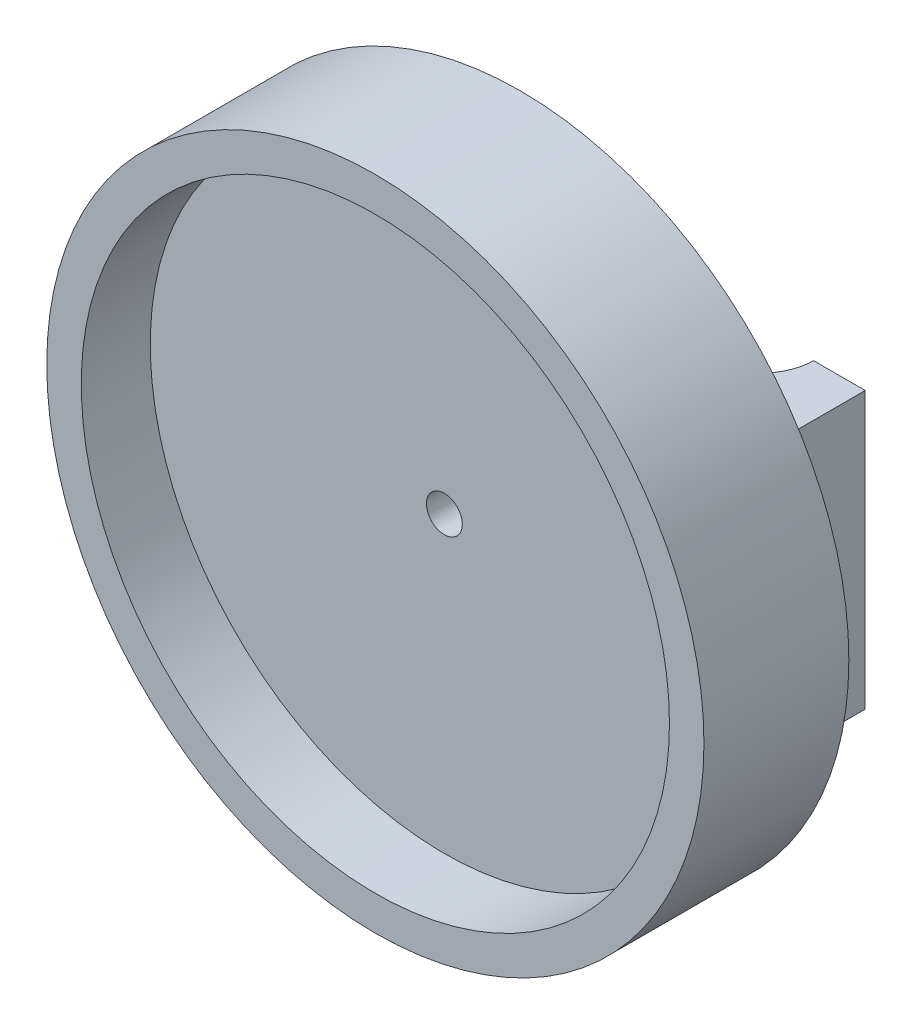
ISO-10303-21;
HEADER;
FILE_DESCRIPTION(('STEP AP214'),'2;1');
FILE_NAME('part.step','',(''),(''),'','','');
FILE_SCHEMA(('AUTOMOTIVE_DESIGN { 1 0 10303 214 1 1 1 1 }'));
ENDSEC;
DATA;
#1=APPLICATION_CONTEXT('core data for automotive mechanical design processes');
#2=APPLICATION_PROTOCOL_DEFINITION('international standard','automotive_design',2000,#1);
#3=PRODUCT_CONTEXT('',#1,'mechanical');
#4=PRODUCT('Part','Part','',(#3));
#5=PRODUCT_RELATED_PRODUCT_CATEGORY('part','',(#4));
#6=PRODUCT_DEFINITION_FORMATION('','',#4);
#7=PRODUCT_DEFINITION_CONTEXT('part definition',#1,'design');
#8=PRODUCT_DEFINITION('design','',#6,#7);
#9=PRODUCT_DEFINITION_SHAPE('','',#8);
#10=(LENGTH_UNIT() NAMED_UNIT(*) SI_UNIT(.MILLI.,.METRE.));
#11=(NAMED_UNIT(*) PLANE_ANGLE_UNIT() SI_UNIT($,.RADIAN.));
#12=(NAMED_UNIT(*) SI_UNIT($,.STERADIAN.) SOLID_ANGLE_UNIT());
#13=UNCERTAINTY_MEASURE_WITH_UNIT(LENGTH_MEASURE(1.E-05),#10,'distance_accuracy_value','');
#14=(GEOMETRIC_REPRESENTATION_CONTEXT(3) GLOBAL_UNCERTAINTY_ASSIGNED_CONTEXT((#13)) GLOBAL_UNIT_ASSIGNED_CONTEXT((#10,
#11,#12)) REPRESENTATION_CONTEXT('',''));
#15=CARTESIAN_POINT('',(0.,0.,0.));
#16=DIRECTION('',(0.,0.,1.));
#17=DIRECTION('',(1.,0.,0.));
#18=AXIS2_PLACEMENT_3D('',#15,#16,#17);
#19=CARTESIAN_POINT('',(0.,0.,-15.));
#20=DIRECTION('',(0.,0.,1.));
#21=DIRECTION('',(1.,0.,0.));
#22=AXIS2_PLACEMENT_3D('',#19,#20,#21);
#23=PLANE('',#22);
#24=CARTESIAN_POINT('',(0.,0.,-15.));
#25=DIRECTION('',(0.,0.,-1.));
#26=DIRECTION('',(-1.,0.,0.));
#27=AXIS2_PLACEMENT_3D('',#24,#25,#26);
#28=CIRCLE('',#27,2.6);
#29=CARTESIAN_POINT('',(-2.6,0.,-15.));
#30=VERTEX_POINT('',#29);
#31=EDGE_CURVE('E193',#30,#30,#28,.T.);
#32=ORIENTED_EDGE('',*,*,#31,.F.);
#33=EDGE_LOOP('',(#32));
#34=FACE_BOUND('',#33,.T.);
#35=DIRECTION('',(-1.,0.,0.));
#36=VECTOR('',#35,1.);
#37=CARTESIAN_POINT('',(0.,-16.5,-15.));
#38=LINE('',#37,#36);
#39=CARTESIAN_POINT('',(12.5,-16.5,-15.));
#40=VERTEX_POINT('',#39);
#41=CARTESIAN_POINT('',(8.5,-16.5,-15.));
#42=VERTEX_POINT('',#41);
#43=EDGE_CURVE('E170',#40,#42,#38,.T.);
#44=ORIENTED_EDGE('',*,*,#43,.F.);
#45=DIRECTION('',(0.,1.,0.));
#46=VECTOR('',#45,1.);
#47=CARTESIAN_POINT('',(12.5,-47.625,-15.));
#48=LINE('',#47,#46);
#49=CARTESIAN_POINT('',(12.5,-20.,-15.));
#50=VERTEX_POINT('',#49);
#51=EDGE_CURVE('E257',#40,#50,#48,.F.);
#52=ORIENTED_EDGE('',*,*,#51,.T.);
#53=DIRECTION('',(-1.,0.,0.));
#54=VECTOR('',#53,1.);
#55=CARTESIAN_POINT('',(35.,-20.,-15.));
#56=LINE('',#55,#54);
#57=CARTESIAN_POINT('',(-12.5,-20.,-15.));
#58=VERTEX_POINT('',#57);
#59=EDGE_CURVE('E218',#50,#58,#56,.T.);
#60=ORIENTED_EDGE('',*,*,#59,.T.);
#61=DIRECTION('',(0.,1.,0.));
#62=VECTOR('',#61,1.);
#63=CARTESIAN_POINT('',(-12.5,-47.625,-15.));
#64=LINE('',#63,#62);
#65=CARTESIAN_POINT('',(-12.5,-16.5,-15.));
#66=VERTEX_POINT('',#65);
#67=EDGE_CURVE('E270',#58,#66,#64,.T.);
#68=ORIENTED_EDGE('',*,*,#67,.T.);
#69=DIRECTION('',(-1.,0.,0.));
#70=VECTOR('',#69,1.);
#71=CARTESIAN_POINT('',(0.,-16.5,-15.));
#72=LINE('',#71,#70);
#73=CARTESIAN_POINT('',(-8.5,-16.5,-15.));
#74=VERTEX_POINT('',#73);
#75=EDGE_CURVE('E188',#74,#66,#72,.T.);
#76=ORIENTED_EDGE('',*,*,#75,.F.);
#77=DIRECTION('',(0.,1.,0.));
#78=VECTOR('',#77,1.);
#79=CARTESIAN_POINT('',(-8.5,-16.5,-15.));
#80=LINE('',#79,#78);
#81=CARTESIAN_POINT('',(-8.5,16.5,-15.));
#82=VERTEX_POINT('',#81);
#83=EDGE_CURVE('E190',#74,#82,#80,.T.);
#84=ORIENTED_EDGE('',*,*,#83,.T.);
#85=DIRECTION('',(-1.,0.,0.));
#86=VECTOR('',#85,1.);
#87=CARTESIAN_POINT('',(0.,16.5,-15.));
#88=LINE('',#87,#86);
#89=CARTESIAN_POINT('',(-12.5,16.5,-15.));
#90=VERTEX_POINT('',#89);
#91=EDGE_CURVE('E183',#82,#90,#88,.T.);
#92=ORIENTED_EDGE('',*,*,#91,.T.);
#93=CARTESIAN_POINT('',(-12.5,20.,-15.));
#94=VERTEX_POINT('',#93);
#95=EDGE_CURVE('E269',#90,#94,#64,.T.);
#96=ORIENTED_EDGE('',*,*,#95,.T.);
#97=DIRECTION('',(1.,0.,0.));
#98=VECTOR('',#97,1.);
#99=CARTESIAN_POINT('',(35.,20.,-15.));
#100=LINE('',#99,#98);
#101=CARTESIAN_POINT('',(12.5,20.,-15.));
#102=VERTEX_POINT('',#101);
#103=EDGE_CURVE('E225',#94,#102,#100,.T.);
#104=ORIENTED_EDGE('',*,*,#103,.T.);
#105=CARTESIAN_POINT('',(12.5,16.5,-15.));
#106=VERTEX_POINT('',#105);
#107=EDGE_CURVE('E260',#102,#106,#48,.F.);
#108=ORIENTED_EDGE('',*,*,#107,.T.);
#109=DIRECTION('',(-1.,0.,0.));
#110=VECTOR('',#109,1.);
#111=CARTESIAN_POINT('',(0.,16.5,-15.));
#112=LINE('',#111,#110);
#113=CARTESIAN_POINT('',(8.5,16.5,-15.));
#114=VERTEX_POINT('',#113);
#115=EDGE_CURVE('E48',#106,#114,#112,.T.);
#116=ORIENTED_EDGE('',*,*,#115,.T.);
#117=DIRECTION('',(0.,1.,0.));
#118=VECTOR('',#117,1.);
#119=CARTESIAN_POINT('',(8.5,-16.5,-15.));
#120=LINE('',#119,#118);
#121=EDGE_CURVE('E160',#114,#42,#120,.F.);
#122=ORIENTED_EDGE('',*,*,#121,.T.);
#123=EDGE_LOOP('',(#44,#52,#60,#68,#76,#84,#92,#96,#104,#108,#116,#122));
#124=FACE_BOUND('',#123,.T.);
#125=ADVANCED_FACE('F33',(#34,#124),#23,.F.);
#126=DIRECTION('',(-1.,0.,0.));
#127=VECTOR('',#126,1.);
#128=CARTESIAN_POINT('',(0.,-16.5,-15.));
#129=LINE('',#128,#127);
#130=CARTESIAN_POINT('',(31.5,-16.5,-15.));
#131=VERTEX_POINT('',#130);
#132=CARTESIAN_POINT('',(27.5,-16.5,-15.));
#133=VERTEX_POINT('',#132);
#134=EDGE_CURVE('E165',#131,#133,#129,.T.);
#135=ORIENTED_EDGE('',*,*,#134,.F.);
#136=DIRECTION('',(0.,1.,0.));
#137=VECTOR('',#136,1.);
#138=CARTESIAN_POINT('',(31.5,-16.5,-15.));
#139=LINE('',#138,#137);
#140=CARTESIAN_POINT('',(31.5,16.5,-15.));
#141=VERTEX_POINT('',#140);
#142=EDGE_CURVE('E11',#131,#141,#139,.T.);
#143=ORIENTED_EDGE('',*,*,#142,.T.);
#144=DIRECTION('',(-1.,0.,0.));
#145=VECTOR('',#144,1.);
#146=CARTESIAN_POINT('',(0.,16.5,-15.));
#147=LINE('',#146,#145);
#148=CARTESIAN_POINT('',(27.5,16.5,-15.));
#149=VERTEX_POINT('',#148);
#150=EDGE_CURVE('E146',#141,#149,#147,.T.);
#151=ORIENTED_EDGE('',*,*,#150,.T.);
#152=DIRECTION('',(0.,1.,0.));
#153=VECTOR('',#152,1.);
#154=CARTESIAN_POINT('',(27.5,-47.625,-15.));
#155=LINE('',#154,#153);
#156=CARTESIAN_POINT('',(27.5,20.,-15.));
#157=VERTEX_POINT('',#156);
#158=EDGE_CURVE('E263',#149,#157,#155,.T.);
#159=ORIENTED_EDGE('',*,*,#158,.T.);
#160=CARTESIAN_POINT('',(35.,20.,-15.));
#161=VERTEX_POINT('',#160);
#162=EDGE_CURVE('E220',#157,#161,#100,.T.);
#163=ORIENTED_EDGE('',*,*,#162,.T.);
#164=DIRECTION('',(0.,-1.,0.));
#165=VECTOR('',#164,1.);
#166=CARTESIAN_POINT('',(35.,-20.,-15.));
#167=LINE('',#166,#165);
#168=CARTESIAN_POINT('',(35.,-20.,-15.));
#169=VERTEX_POINT('',#168);
#170=EDGE_CURVE('E210',#161,#169,#167,.T.);
#171=ORIENTED_EDGE('',*,*,#170,.T.);
#172=CARTESIAN_POINT('',(27.5,-20.,-15.));
#173=VERTEX_POINT('',#172);
#174=EDGE_CURVE('E215',#169,#173,#56,.T.);
#175=ORIENTED_EDGE('',*,*,#174,.T.);
#176=EDGE_CURVE('E167',#173,#133,#155,.T.);
#177=ORIENTED_EDGE('',*,*,#176,.T.);
#178=EDGE_LOOP('',(#135,#143,#151,#159,#163,#171,#175,#177));
#179=FACE_BOUND('',#178,.T.);
#180=ADVANCED_FACE('F163',(#179),#23,.F.);
#181=CARTESIAN_POINT('',(20.,-47.625,-15.));
#182=DIRECTION('',(0.,1.,0.));
#183=DIRECTION('',(0.,0.,1.));
#184=AXIS2_PLACEMENT_3D('',#181,#182,#183);
#185=CYLINDRICAL_SURFACE('',#184,7.5);
#186=CARTESIAN_POINT('',(20.,-16.5,-15.));
#187=DIRECTION('',(0.,1.,0.));
#188=DIRECTION('',(0.,0.,1.));
#189=AXIS2_PLACEMENT_3D('',#186,#187,#188);
#190=CIRCLE('',#189,7.5);
#191=EDGE_CURVE('E41',#133,#40,#190,.F.);
#192=ORIENTED_EDGE('',*,*,#191,.F.);
#193=ORIENTED_EDGE('',*,*,#176,.F.);
#194=CARTESIAN_POINT('',(20.,-20.,-15.));
#195=DIRECTION('',(0.,1.,0.));
#196=DIRECTION('',(0.,0.,1.));
#197=AXIS2_PLACEMENT_3D('',#194,#195,#196);
#198=CIRCLE('',#197,7.5);
#199=EDGE_CURVE('E206',#50,#173,#198,.T.);
#200=ORIENTED_EDGE('',*,*,#199,.F.);
#201=ORIENTED_EDGE('',*,*,#51,.F.);
#202=EDGE_LOOP('',(#192,#193,#200,#201));
#203=FACE_BOUND('',#202,.T.);
#204=ADVANCED_FACE('F289',(#203),#185,.F.);
#205=DIRECTION('',(-1.,0.,0.));
#206=VECTOR('',#205,1.);
#207=CARTESIAN_POINT('',(0.,-16.5,-15.));
#208=LINE('',#207,#206);
#209=CARTESIAN_POINT('',(-27.5,-16.5,-15.));
#210=VERTEX_POINT('',#209);
#211=CARTESIAN_POINT('',(-31.5,-16.5,-15.));
#212=VERTEX_POINT('',#211);
#213=EDGE_CURVE('E186',#210,#212,#208,.T.);
#214=ORIENTED_EDGE('',*,*,#213,.F.);
#215=DIRECTION('',(0.,1.,0.));
#216=VECTOR('',#215,1.);
#217=CARTESIAN_POINT('',(-27.5,-47.625,-15.));
#218=LINE('',#217,#216);
#219=CARTESIAN_POINT('',(-27.5,-20.,-15.));
#220=VERTEX_POINT('',#219);
#221=EDGE_CURVE('E265',#210,#220,#218,.F.);
#222=ORIENTED_EDGE('',*,*,#221,.T.);
#223=CARTESIAN_POINT('',(-35.,-20.,-15.));
#224=VERTEX_POINT('',#223);
#225=EDGE_CURVE('E213',#220,#224,#56,.T.);
#226=ORIENTED_EDGE('',*,*,#225,.T.);
#227=DIRECTION('',(0.,1.,0.));
#228=VECTOR('',#227,1.);
#229=CARTESIAN_POINT('',(-35.,-20.,-15.));
#230=LINE('',#229,#228);
#231=CARTESIAN_POINT('',(-35.,20.,-15.));
#232=VERTEX_POINT('',#231);
#233=EDGE_CURVE('E217',#224,#232,#230,.T.);
#234=ORIENTED_EDGE('',*,*,#233,.T.);
#235=CARTESIAN_POINT('',(-27.5,20.,-15.));
#236=VERTEX_POINT('',#235);
#237=EDGE_CURVE('E221',#232,#236,#100,.T.);
#238=ORIENTED_EDGE('',*,*,#237,.T.);
#239=CARTESIAN_POINT('',(-27.5,16.5,-15.));
#240=VERTEX_POINT('',#239);
#241=EDGE_CURVE('E266',#236,#240,#218,.F.);
#242=ORIENTED_EDGE('',*,*,#241,.T.);
#243=DIRECTION('',(-1.,0.,0.));
#244=VECTOR('',#243,1.);
#245=CARTESIAN_POINT('',(0.,16.5,-15.));
#246=LINE('',#245,#244);
#247=CARTESIAN_POINT('',(-31.5,16.5,-15.));
#248=VERTEX_POINT('',#247);
#249=EDGE_CURVE('E56',#240,#248,#246,.T.);
#250=ORIENTED_EDGE('',*,*,#249,.T.);
#251=DIRECTION('',(0.,1.,0.));
#252=VECTOR('',#251,1.);
#253=CARTESIAN_POINT('',(-31.5,-16.5,-15.));
#254=LINE('',#253,#252);
#255=EDGE_CURVE('E279',#248,#212,#254,.F.);
#256=ORIENTED_EDGE('',*,*,#255,.T.);
#257=EDGE_LOOP('',(#214,#222,#226,#234,#238,#242,#250,#256));
#258=FACE_BOUND('',#257,.T.);
#259=ADVANCED_FACE('F298',(#258),#23,.F.);
#260=CARTESIAN_POINT('',(-20.,-47.625,-15.));
#261=DIRECTION('',(0.,1.,0.));
#262=DIRECTION('',(0.,0.,1.));
#263=AXIS2_PLACEMENT_3D('',#260,#261,#262);
#264=CYLINDRICAL_SURFACE('',#263,7.5);
#265=CARTESIAN_POINT('',(-20.,-16.5,-15.));
#266=DIRECTION('',(0.,1.,0.));
#267=DIRECTION('',(0.,0.,1.));
#268=AXIS2_PLACEMENT_3D('',#265,#266,#267);
#269=CIRCLE('',#268,7.5);
#270=EDGE_CURVE('E277',#66,#210,#269,.F.);
#271=ORIENTED_EDGE('',*,*,#270,.F.);
#272=ORIENTED_EDGE('',*,*,#67,.F.);
#273=CARTESIAN_POINT('',(-20.,-20.,-15.));
#274=DIRECTION('',(0.,1.,0.));
#275=DIRECTION('',(0.,0.,1.));
#276=AXIS2_PLACEMENT_3D('',#273,#274,#275);
#277=CIRCLE('',#276,7.5);
#278=EDGE_CURVE('E200',#220,#58,#277,.T.);
#279=ORIENTED_EDGE('',*,*,#278,.F.);
#280=ORIENTED_EDGE('',*,*,#221,.F.);
#281=EDGE_LOOP('',(#271,#272,#279,#280));
#282=FACE_BOUND('',#281,.T.);
#283=ADVANCED_FACE('F321',(#282),#264,.F.);
#284=CARTESIAN_POINT('',(0.,0.,0.));
#285=DIRECTION('',(0.,0.,1.));
#286=DIRECTION('',(1.,0.,0.));
#287=AXIS2_PLACEMENT_3D('',#284,#285,#286);
#288=PLANE('',#287);
#289=CARTESIAN_POINT('',(0.,0.,0.));
#290=DIRECTION('',(0.,0.,1.));
#291=DIRECTION('',(1.,0.,0.));
#292=AXIS2_PLACEMENT_3D('',#289,#290,#291);
#293=CIRCLE('',#292,47.625);
#294=CARTESIAN_POINT('',(-47.625,0.,0.));
#295=VERTEX_POINT('',#294);
#296=EDGE_CURVE('E251',#295,#295,#293,.T.);
#297=ORIENTED_EDGE('',*,*,#296,.F.);
#298=EDGE_LOOP('',(#297));
#299=FACE_BOUND('',#298,.T.);
#300=DIRECTION('',(0.,-1.,0.));
#301=VECTOR('',#300,1.);
#302=CARTESIAN_POINT('',(35.,-20.,0.));
#303=LINE('',#302,#301);
#304=CARTESIAN_POINT('',(35.,20.,0.));
#305=VERTEX_POINT('',#304);
#306=CARTESIAN_POINT('',(35.,-20.,0.));
#307=VERTEX_POINT('',#306);
#308=EDGE_CURVE('E209',#305,#307,#303,.T.);
#309=ORIENTED_EDGE('',*,*,#308,.F.);
#310=DIRECTION('',(1.,0.,0.));
#311=VECTOR('',#310,1.);
#312=CARTESIAN_POINT('',(35.,20.,0.));
#313=LINE('',#312,#311);
#314=CARTESIAN_POINT('',(-35.,20.,0.));
#315=VERTEX_POINT('',#314);
#316=EDGE_CURVE('E214',#315,#305,#313,.T.);
#317=ORIENTED_EDGE('',*,*,#316,.F.);
#318=DIRECTION('',(0.,1.,0.));
#319=VECTOR('',#318,1.);
#320=CARTESIAN_POINT('',(-35.,-20.,0.));
#321=LINE('',#320,#319);
#322=CARTESIAN_POINT('',(-35.,-20.,0.));
#323=VERTEX_POINT('',#322);
#324=EDGE_CURVE('E231',#323,#315,#321,.T.);
#325=ORIENTED_EDGE('',*,*,#324,.F.);
#326=DIRECTION('',(-1.,0.,0.));
#327=VECTOR('',#326,1.);
#328=CARTESIAN_POINT('',(35.,-20.,0.));
#329=LINE('',#328,#327);
#330=EDGE_CURVE('E228',#307,#323,#329,.T.);
#331=ORIENTED_EDGE('',*,*,#330,.F.);
#332=EDGE_LOOP('',(#309,#317,#325,#331));
#333=FACE_BOUND('',#332,.T.);
#334=ADVANCED_FACE('F323',(#299,#333),#288,.F.);
#335=CARTESIAN_POINT('',(0.,0.,21.));
#336=DIRECTION('',(0.,0.,-1.));
#337=DIRECTION('',(-1.,0.,0.));
#338=AXIS2_PLACEMENT_3D('',#335,#336,#337);
#339=CYLINDRICAL_SURFACE('',#338,47.625);
#340=CARTESIAN_POINT('',(0.,0.,21.));
#341=DIRECTION('',(0.,0.,1.));
#342=DIRECTION('',(1.,0.,0.));
#343=AXIS2_PLACEMENT_3D('',#340,#341,#342);
#344=CIRCLE('',#343,47.625);
#345=CARTESIAN_POINT('',(-47.625,0.,21.));
#346=VERTEX_POINT('',#345);
#347=EDGE_CURVE('E254',#346,#346,#344,.T.);
#348=CARTESIAN_POINT('',(-47.625,0.,21.));
#349=CARTESIAN_POINT('',(-47.625,0.,20.78125));
#350=CARTESIAN_POINT('',(-47.625,0.,20.5625));
#351=CARTESIAN_POINT('',(-47.625,0.,20.125));
#352=CARTESIAN_POINT('',(-47.625,0.,19.90625));
#353=CARTESIAN_POINT('',(-47.625,0.,19.46875));
#354=CARTESIAN_POINT('',(-47.625,0.,19.25));
#355=CARTESIAN_POINT('',(-47.625,0.,18.8125));
#356=CARTESIAN_POINT('',(-47.625,0.,18.59375));
#357=CARTESIAN_POINT('',(-47.625,0.,18.15625));
#358=CARTESIAN_POINT('',(-47.625,0.,17.9375));
#359=CARTESIAN_POINT('',(-47.625,0.,17.5));
#360=CARTESIAN_POINT('',(-47.625,0.,17.28125));
#361=CARTESIAN_POINT('',(-47.625,0.,16.84375));
#362=CARTESIAN_POINT('',(-47.625,0.,16.625));
#363=CARTESIAN_POINT('',(-47.625,0.,16.1875));
#364=CARTESIAN_POINT('',(-47.625,0.,15.96875));
#365=CARTESIAN_POINT('',(-47.625,0.,15.53125));
#366=CARTESIAN_POINT('',(-47.625,0.,15.3125));
#367=CARTESIAN_POINT('',(-47.625,0.,14.875));
#368=CARTESIAN_POINT('',(-47.625,0.,14.65625));
#369=CARTESIAN_POINT('',(-47.625,0.,14.21875));
#370=CARTESIAN_POINT('',(-47.625,0.,14.));
#371=CARTESIAN_POINT('',(-47.625,0.,13.5625));
#372=CARTESIAN_POINT('',(-47.625,0.,13.34375));
#373=CARTESIAN_POINT('',(-47.625,0.,12.90625));
#374=CARTESIAN_POINT('',(-47.625,0.,12.6875));
#375=CARTESIAN_POINT('',(-47.625,0.,12.25));
#376=CARTESIAN_POINT('',(-47.625,0.,12.03125));
#377=CARTESIAN_POINT('',(-47.625,0.,11.59375));
#378=CARTESIAN_POINT('',(-47.625,0.,11.375));
#379=CARTESIAN_POINT('',(-47.625,0.,10.9375));
#380=CARTESIAN_POINT('',(-47.625,0.,10.71875));
#381=CARTESIAN_POINT('',(-47.625,0.,10.28125));
#382=CARTESIAN_POINT('',(-47.625,0.,10.0625));
#383=CARTESIAN_POINT('',(-47.625,0.,9.625));
#384=CARTESIAN_POINT('',(-47.625,0.,9.40625));
#385=CARTESIAN_POINT('',(-47.625,0.,8.96875));
#386=CARTESIAN_POINT('',(-47.625,0.,8.75));
#387=CARTESIAN_POINT('',(-47.625,0.,8.3125));
#388=CARTESIAN_POINT('',(-47.625,0.,8.09375));
#389=CARTESIAN_POINT('',(-47.625,0.,7.65625));
#390=CARTESIAN_POINT('',(-47.625,0.,7.4375));
#391=CARTESIAN_POINT('',(-47.625,0.,7.));
#392=CARTESIAN_POINT('',(-47.625,0.,6.78125));
#393=CARTESIAN_POINT('',(-47.625,0.,6.34375));
#394=CARTESIAN_POINT('',(-47.625,0.,6.125));
#395=CARTESIAN_POINT('',(-47.625,0.,5.6875));
#396=CARTESIAN_POINT('',(-47.625,0.,5.46875));
#397=CARTESIAN_POINT('',(-47.625,0.,5.03125));
#398=CARTESIAN_POINT('',(-47.625,0.,4.8125));
#399=CARTESIAN_POINT('',(-47.625,0.,4.375));
#400=CARTESIAN_POINT('',(-47.625,0.,4.15625));
#401=CARTESIAN_POINT('',(-47.625,0.,3.71875));
#402=CARTESIAN_POINT('',(-47.625,0.,3.5));
#403=CARTESIAN_POINT('',(-47.625,0.,3.0625));
#404=CARTESIAN_POINT('',(-47.625,0.,2.84375));
#405=CARTESIAN_POINT('',(-47.625,0.,2.40625));
#406=CARTESIAN_POINT('',(-47.625,0.,2.1875));
#407=CARTESIAN_POINT('',(-47.625,0.,1.75));
#408=CARTESIAN_POINT('',(-47.625,0.,1.53125));
#409=CARTESIAN_POINT('',(-47.625,0.,1.09375));
#410=CARTESIAN_POINT('',(-47.625,0.,0.875000000000001));
#411=CARTESIAN_POINT('',(-47.625,0.,0.4375));
#412=CARTESIAN_POINT('',(-47.625,0.,0.21875));
#413=CARTESIAN_POINT('',(-47.625,0.,0.));
#414=B_SPLINE_CURVE_WITH_KNOTS('',3,(#348,#349,#350,#351,#352,#353,#354,#355,#356,#357,#358,
#359,#360,#361,#362,#363,#364,#365,#366,#367,#368,#369,#370,#371,#372,#373,#374,#375,#376,#377,
#378,#379,#380,#381,#382,#383,#384,#385,#386,#387,#388,#389,#390,#391,#392,#393,#394,#395,#396,
#397,#398,#399,#400,#401,#402,#403,#404,#405,#406,#407,#408,#409,#410,#411,#412,#413),
.UNSPECIFIED.,.F.,.F.,(4,2,2,2,2,2,2,2,2,2,2,2,2,2,2,2,2,2,2,2,2,2,2,2,2,2,2,2,2,2,2,2,4),(0.,
0.656249999999997,1.3125,1.96875,2.625,3.28125,3.9375,4.59375,5.25,5.90625,6.5625,7.21875,7.875,
8.53125,9.1875,9.84375,10.5,11.15625,11.8125,12.46875,13.125,13.78125,14.4375,15.09375,15.75,
16.40625,17.0625,17.71875,18.375,19.03125,19.6875,20.34375,21.),.UNSPECIFIED.);
#415=EDGE_CURVE('BSEAM35',#346,#295,#414,.T.);
#416=ORIENTED_EDGE('',*,*,#347,.F.);
#417=ORIENTED_EDGE('',*,*,#296,.T.);
#418=ORIENTED_EDGE('',*,*,#415,.T.);
#419=ORIENTED_EDGE('',*,*,#415,.F.);
#420=EDGE_LOOP('',(#416,#418,#417,#419));
#421=FACE_BOUND('',#420,.T.);
#422=ADVANCED_FACE('F35',(#421),#339,.T.);
#423=CARTESIAN_POINT('',(0.,0.,21.));
#424=DIRECTION('',(0.,0.,1.));
#425=DIRECTION('',(1.,0.,0.));
#426=AXIS2_PLACEMENT_3D('',#423,#424,#425);
#427=PLANE('',#426);
#428=CARTESIAN_POINT('',(0.,0.,21.));
#429=DIRECTION('',(0.,0.,1.));
#430=DIRECTION('',(1.,0.,0.));
#431=AXIS2_PLACEMENT_3D('',#428,#429,#430);
#432=CIRCLE('',#431,42.625);
#433=CARTESIAN_POINT('',(42.625,0.,21.));
#434=VERTEX_POINT('',#433);
#435=EDGE_CURVE('E247',#434,#434,#432,.T.);
#436=ORIENTED_EDGE('',*,*,#435,.F.);
#437=EDGE_LOOP('',(#436));
#438=FACE_BOUND('',#437,.T.);
#439=ORIENTED_EDGE('',*,*,#347,.T.);
#440=EDGE_LOOP('',(#439));
#441=FACE_BOUND('',#440,.T.);
#442=ADVANCED_FACE('F360',(#438,#441),#427,.T.);
#443=CARTESIAN_POINT('',(0.,0.,11.));
#444=DIRECTION('',(0.,0.,1.));
#445=DIRECTION('',(1.,0.,0.));
#446=AXIS2_PLACEMENT_3D('',#443,#444,#445);
#447=CYLINDRICAL_SURFACE('',#446,42.625);
#448=CARTESIAN_POINT('',(0.,0.,11.));
#449=DIRECTION('',(0.,0.,1.));
#450=DIRECTION('',(1.,0.,0.));
#451=AXIS2_PLACEMENT_3D('',#448,#449,#450);
#452=CIRCLE('',#451,42.625);
#453=CARTESIAN_POINT('',(42.625,0.,11.));
#454=VERTEX_POINT('',#453);
#455=EDGE_CURVE('E248',#454,#454,#452,.T.);
#456=ORIENTED_EDGE('',*,*,#455,.F.);
#457=EDGE_LOOP('',(#456));
#458=FACE_BOUND('',#457,.T.);
#459=ORIENTED_EDGE('',*,*,#435,.T.);
#460=EDGE_LOOP('',(#459));
#461=FACE_BOUND('',#460,.T.);
#462=ADVANCED_FACE('F356',(#458,#461),#447,.F.);
#463=CARTESIAN_POINT('',(0.,0.,11.));
#464=DIRECTION('',(0.,0.,1.));
#465=DIRECTION('',(1.,0.,0.));
#466=AXIS2_PLACEMENT_3D('',#463,#464,#465);
#467=PLANE('',#466);
#468=CARTESIAN_POINT('',(0.,0.,11.));
#469=DIRECTION('',(0.,0.,1.));
#470=DIRECTION('',(1.,0.,0.));
#471=AXIS2_PLACEMENT_3D('',#468,#469,#470);
#472=CIRCLE('',#471,2.6);
#473=CARTESIAN_POINT('',(2.6,0.,11.));
#474=VERTEX_POINT('',#473);
#475=EDGE_CURVE('E196',#474,#474,#472,.T.);
#476=ORIENTED_EDGE('',*,*,#475,.F.);
#477=EDGE_LOOP('',(#476));
#478=FACE_BOUND('',#477,.T.);
#479=ORIENTED_EDGE('',*,*,#455,.T.);
#480=EDGE_LOOP('',(#479));
#481=FACE_BOUND('',#480,.T.);
#482=ADVANCED_FACE('F352',(#478,#481),#467,.T.);
#483=CARTESIAN_POINT('',(35.,-20.,-15.));
#484=DIRECTION('',(-1.,0.,0.));
#485=DIRECTION('',(0.,0.,1.));
#486=AXIS2_PLACEMENT_3D('',#483,#484,#485);
#487=PLANE('',#486);
#488=ORIENTED_EDGE('',*,*,#308,.T.);
#489=DIRECTION('',(0.,0.,1.));
#490=VECTOR('',#489,1.);
#491=CARTESIAN_POINT('',(35.,-20.,-15.));
#492=LINE('',#491,#490);
#493=EDGE_CURVE('E244',#169,#307,#492,.T.);
#494=ORIENTED_EDGE('',*,*,#493,.F.);
#495=ORIENTED_EDGE('',*,*,#170,.F.);
#496=DIRECTION('',(0.,0.,1.));
#497=VECTOR('',#496,1.);
#498=CARTESIAN_POINT('',(35.,20.,-15.));
#499=LINE('',#498,#497);
#500=EDGE_CURVE('E224',#161,#305,#499,.T.);
#501=ORIENTED_EDGE('',*,*,#500,.T.);
#502=EDGE_LOOP('',(#488,#494,#495,#501));
#503=FACE_BOUND('',#502,.T.);
#504=ADVANCED_FACE('F349',(#503),#487,.F.);
#505=CARTESIAN_POINT('',(35.,-20.,-15.));
#506=DIRECTION('',(0.,1.,0.));
#507=DIRECTION('',(0.,0.,1.));
#508=AXIS2_PLACEMENT_3D('',#505,#506,#507);
#509=PLANE('',#508);
#510=ORIENTED_EDGE('',*,*,#225,.F.);
#511=ORIENTED_EDGE('',*,*,#278,.T.);
#512=ORIENTED_EDGE('',*,*,#59,.F.);
#513=ORIENTED_EDGE('',*,*,#199,.T.);
#514=ORIENTED_EDGE('',*,*,#174,.F.);
#515=ORIENTED_EDGE('',*,*,#493,.T.);
#516=ORIENTED_EDGE('',*,*,#330,.T.);
#517=DIRECTION('',(0.,0.,1.));
#518=VECTOR('',#517,1.);
#519=CARTESIAN_POINT('',(-35.,-20.,-15.));
#520=LINE('',#519,#518);
#521=EDGE_CURVE('E241',#224,#323,#520,.T.);
#522=ORIENTED_EDGE('',*,*,#521,.F.);
#523=EDGE_LOOP('',(#510,#511,#512,#513,#514,#515,#516,#522));
#524=FACE_BOUND('',#523,.T.);
#525=ADVANCED_FACE('F293',(#524),#509,.F.);
#526=CARTESIAN_POINT('',(-35.,-20.,-15.));
#527=DIRECTION('',(1.,0.,0.));
#528=DIRECTION('',(0.,0.,-1.));
#529=AXIS2_PLACEMENT_3D('',#526,#527,#528);
#530=PLANE('',#529);
#531=ORIENTED_EDGE('',*,*,#324,.T.);
#532=DIRECTION('',(0.,0.,1.));
#533=VECTOR('',#532,1.);
#534=CARTESIAN_POINT('',(-35.,20.,-15.));
#535=LINE('',#534,#533);
#536=EDGE_CURVE('E238',#232,#315,#535,.T.);
#537=ORIENTED_EDGE('',*,*,#536,.F.);
#538=ORIENTED_EDGE('',*,*,#233,.F.);
#539=ORIENTED_EDGE('',*,*,#521,.T.);
#540=EDGE_LOOP('',(#531,#537,#538,#539));
#541=FACE_BOUND('',#540,.T.);
#542=ADVANCED_FACE('F303',(#541),#530,.F.);
#543=CARTESIAN_POINT('',(35.,20.,-15.));
#544=DIRECTION('',(0.,-1.,0.));
#545=DIRECTION('',(0.,0.,-1.));
#546=AXIS2_PLACEMENT_3D('',#543,#544,#545);
#547=PLANE('',#546);
#548=ORIENTED_EDGE('',*,*,#103,.F.);
#549=CARTESIAN_POINT('',(-20.,20.,-15.));
#550=DIRECTION('',(0.,1.,0.));
#551=DIRECTION('',(0.,0.,1.));
#552=AXIS2_PLACEMENT_3D('',#549,#550,#551);
#553=CIRCLE('',#552,7.5);
#554=EDGE_CURVE('E197',#236,#94,#553,.T.);
#555=ORIENTED_EDGE('',*,*,#554,.F.);
#556=ORIENTED_EDGE('',*,*,#237,.F.);
#557=ORIENTED_EDGE('',*,*,#536,.T.);
#558=ORIENTED_EDGE('',*,*,#316,.T.);
#559=ORIENTED_EDGE('',*,*,#500,.F.);
#560=ORIENTED_EDGE('',*,*,#162,.F.);
#561=CARTESIAN_POINT('',(20.,20.,-15.));
#562=DIRECTION('',(0.,1.,0.));
#563=DIRECTION('',(0.,0.,1.));
#564=AXIS2_PLACEMENT_3D('',#561,#562,#563);
#565=CIRCLE('',#564,7.5);
#566=EDGE_CURVE('E203',#102,#157,#565,.T.);
#567=ORIENTED_EDGE('',*,*,#566,.F.);
#568=EDGE_LOOP('',(#548,#555,#556,#557,#558,#559,#560,#567));
#569=FACE_BOUND('',#568,.T.);
#570=ADVANCED_FACE('F308',(#569),#547,.F.);
#571=ORIENTED_EDGE('',*,*,#158,.F.);
#572=CARTESIAN_POINT('',(20.,16.5,-15.));
#573=DIRECTION('',(0.,1.,0.));
#574=DIRECTION('',(0.,0.,1.));
#575=AXIS2_PLACEMENT_3D('',#572,#573,#574);
#576=CIRCLE('',#575,7.5);
#577=EDGE_CURVE('E150',#149,#106,#576,.F.);
#578=ORIENTED_EDGE('',*,*,#577,.T.);
#579=ORIENTED_EDGE('',*,*,#107,.F.);
#580=ORIENTED_EDGE('',*,*,#566,.T.);
#581=EDGE_LOOP('',(#571,#578,#579,#580));
#582=FACE_BOUND('',#581,.T.);
#583=ADVANCED_FACE('F335',(#582),#185,.F.);
#584=ORIENTED_EDGE('',*,*,#95,.F.);
#585=CARTESIAN_POINT('',(-20.,16.5,-15.));
#586=DIRECTION('',(0.,1.,0.));
#587=DIRECTION('',(0.,0.,1.));
#588=AXIS2_PLACEMENT_3D('',#585,#586,#587);
#589=CIRCLE('',#588,7.5);
#590=EDGE_CURVE('E273',#90,#240,#589,.F.);
#591=ORIENTED_EDGE('',*,*,#590,.T.);
#592=ORIENTED_EDGE('',*,*,#241,.F.);
#593=ORIENTED_EDGE('',*,*,#554,.T.);
#594=EDGE_LOOP('',(#584,#591,#592,#593));
#595=FACE_BOUND('',#594,.T.);
#596=ADVANCED_FACE('F311',(#595),#264,.F.);
#597=CARTESIAN_POINT('',(0.,0.,21.));
#598=DIRECTION('',(0.,0.,-1.));
#599=DIRECTION('',(-1.,0.,0.));
#600=AXIS2_PLACEMENT_3D('',#597,#598,#599);
#601=CYLINDRICAL_SURFACE('',#600,2.6);
#602=ORIENTED_EDGE('',*,*,#475,.T.);
#603=EDGE_LOOP('',(#602));
#604=FACE_BOUND('',#603,.T.);
#605=ORIENTED_EDGE('',*,*,#31,.T.);
#606=EDGE_LOOP('',(#605));
#607=FACE_BOUND('',#606,.T.);
#608=ADVANCED_FACE('F334',(#604,#607),#601,.F.);
#609=CARTESIAN_POINT('',(-20.,-16.5,-15.));
#610=DIRECTION('',(0.,1.,0.));
#611=DIRECTION('',(0.,0.,1.));
#612=AXIS2_PLACEMENT_3D('',#609,#610,#611);
#613=CYLINDRICAL_SURFACE('',#612,11.5);
#614=CARTESIAN_POINT('',(-20.,-16.5,-15.));
#615=DIRECTION('',(0.,1.,0.));
#616=DIRECTION('',(0.,0.,1.));
#617=AXIS2_PLACEMENT_3D('',#614,#615,#616);
#618=CIRCLE('',#617,11.5);
#619=EDGE_CURVE('E177',#212,#74,#618,.T.);
#620=ORIENTED_EDGE('',*,*,#619,.F.);
#621=ORIENTED_EDGE('',*,*,#255,.F.);
#622=CARTESIAN_POINT('',(-20.,16.5,-15.));
#623=DIRECTION('',(0.,1.,0.));
#624=DIRECTION('',(0.,0.,1.));
#625=AXIS2_PLACEMENT_3D('',#622,#623,#624);
#626=CIRCLE('',#625,11.5);
#627=EDGE_CURVE('E176',#248,#82,#626,.T.);
#628=ORIENTED_EDGE('',*,*,#627,.T.);
#629=ORIENTED_EDGE('',*,*,#83,.F.);
#630=EDGE_LOOP('',(#620,#621,#628,#629));
#631=FACE_BOUND('',#630,.T.);
#632=ADVANCED_FACE('F316',(#631),#613,.F.);
#633=CARTESIAN_POINT('',(-20.,-16.5,-15.));
#634=DIRECTION('',(0.,1.,0.));
#635=DIRECTION('',(0.,0.,1.));
#636=AXIS2_PLACEMENT_3D('',#633,#634,#635);
#637=PLANE('',#636);
#638=ORIENTED_EDGE('',*,*,#75,.T.);
#639=ORIENTED_EDGE('',*,*,#270,.T.);
#640=ORIENTED_EDGE('',*,*,#213,.T.);
#641=ORIENTED_EDGE('',*,*,#619,.T.);
#642=EDGE_LOOP('',(#638,#639,#640,#641));
#643=FACE_BOUND('',#642,.T.);
#644=ADVANCED_FACE('F318',(#643),#637,.T.);
#645=CARTESIAN_POINT('',(-20.,16.5,-15.));
#646=DIRECTION('',(0.,1.,0.));
#647=DIRECTION('',(0.,0.,1.));
#648=AXIS2_PLACEMENT_3D('',#645,#646,#647);
#649=PLANE('',#648);
#650=ORIENTED_EDGE('',*,*,#627,.F.);
#651=ORIENTED_EDGE('',*,*,#249,.F.);
#652=ORIENTED_EDGE('',*,*,#590,.F.);
#653=ORIENTED_EDGE('',*,*,#91,.F.);
#654=EDGE_LOOP('',(#650,#651,#652,#653));
#655=FACE_BOUND('',#654,.T.);
#656=ADVANCED_FACE('F312',(#655),#649,.F.);
#657=CARTESIAN_POINT('',(20.,-16.5,-15.));
#658=DIRECTION('',(0.,1.,0.));
#659=DIRECTION('',(0.,0.,1.));
#660=AXIS2_PLACEMENT_3D('',#657,#658,#659);
#661=CYLINDRICAL_SURFACE('',#660,11.5);
#662=CARTESIAN_POINT('',(20.,16.5,-15.));
#663=DIRECTION('',(0.,1.,0.));
#664=DIRECTION('',(0.,0.,1.));
#665=AXIS2_PLACEMENT_3D('',#662,#663,#664);
#666=CIRCLE('',#665,11.5);
#667=EDGE_CURVE('E149',#114,#141,#666,.T.);
#668=ORIENTED_EDGE('',*,*,#667,.T.);
#669=ORIENTED_EDGE('',*,*,#142,.F.);
#670=CARTESIAN_POINT('',(20.,-16.5,-15.));
#671=DIRECTION('',(0.,1.,0.));
#672=DIRECTION('',(0.,0.,1.));
#673=AXIS2_PLACEMENT_3D('',#670,#671,#672);
#674=CIRCLE('',#673,11.5);
#675=EDGE_CURVE('E153',#42,#131,#674,.T.);
#676=ORIENTED_EDGE('',*,*,#675,.F.);
#677=ORIENTED_EDGE('',*,*,#121,.F.);
#678=EDGE_LOOP('',(#668,#669,#676,#677));
#679=FACE_BOUND('',#678,.T.);
#680=ADVANCED_FACE('F156',(#679),#661,.F.);
#681=CARTESIAN_POINT('',(20.,-16.5,-15.));
#682=DIRECTION('',(0.,1.,0.));
#683=DIRECTION('',(0.,0.,1.));
#684=AXIS2_PLACEMENT_3D('',#681,#682,#683);
#685=PLANE('',#684);
#686=ORIENTED_EDGE('',*,*,#43,.T.);
#687=ORIENTED_EDGE('',*,*,#675,.T.);
#688=ORIENTED_EDGE('',*,*,#134,.T.);
#689=ORIENTED_EDGE('',*,*,#191,.T.);
#690=EDGE_LOOP('',(#686,#687,#688,#689));
#691=FACE_BOUND('',#690,.T.);
#692=ADVANCED_FACE('F283',(#691),#685,.T.);
#693=CARTESIAN_POINT('',(20.,16.5,-15.));
#694=DIRECTION('',(0.,1.,0.));
#695=DIRECTION('',(0.,0.,1.));
#696=AXIS2_PLACEMENT_3D('',#693,#694,#695);
#697=PLANE('',#696);
#698=ORIENTED_EDGE('',*,*,#577,.F.);
#699=ORIENTED_EDGE('',*,*,#150,.F.);
#700=ORIENTED_EDGE('',*,*,#667,.F.);
#701=ORIENTED_EDGE('',*,*,#115,.F.);
#702=EDGE_LOOP('',(#698,#699,#700,#701));
#703=FACE_BOUND('',#702,.T.);
#704=ADVANCED_FACE('F148',(#703),#697,.F.);
#705=CLOSED_SHELL('',(#125,#180,#204,#259,#283,#334,#422,#442,#462,#482,#504,#525,#542,#570,
#583,#596,#608,#632,#644,#656,#680,#692,#704));
#706=MANIFOLD_SOLID_BREP('B2',#705);
#707=ADVANCED_BREP_SHAPE_REPRESENTATION('',(#18,#706),#14);
#708=SHAPE_DEFINITION_REPRESENTATION(#9,#707);
ENDSEC;
END-ISO-10303-21;
